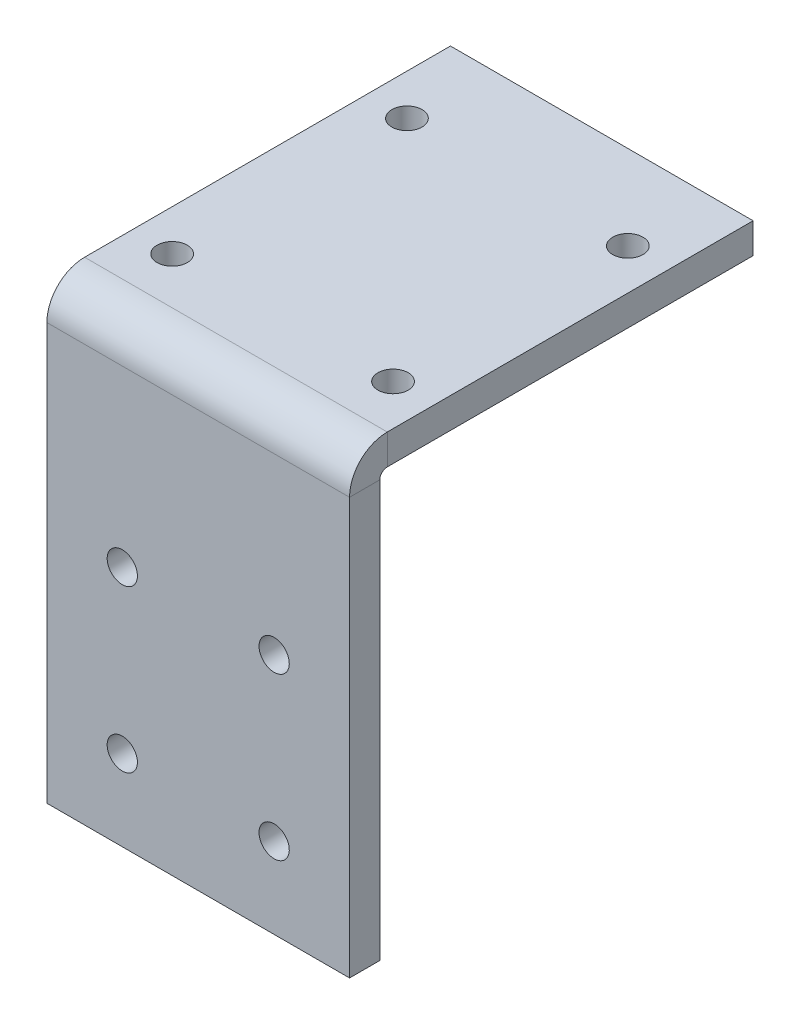
ISO-10303-21;
HEADER;
FILE_DESCRIPTION(('STEP AP214'),'2;1');
FILE_NAME('part.step','',(''),(''),'','','');
FILE_SCHEMA(('AUTOMOTIVE_DESIGN { 1 0 10303 214 1 1 1 1 }'));
ENDSEC;
DATA;
#1=APPLICATION_CONTEXT('core data for automotive mechanical design processes');
#2=APPLICATION_PROTOCOL_DEFINITION('international standard','automotive_design',2000,#1);
#3=PRODUCT_CONTEXT('',#1,'mechanical');
#4=PRODUCT('Part','Part','',(#3));
#5=PRODUCT_RELATED_PRODUCT_CATEGORY('part','',(#4));
#6=PRODUCT_DEFINITION_FORMATION('','',#4);
#7=PRODUCT_DEFINITION_CONTEXT('part definition',#1,'design');
#8=PRODUCT_DEFINITION('design','',#6,#7);
#9=PRODUCT_DEFINITION_SHAPE('','',#8);
#10=(LENGTH_UNIT() NAMED_UNIT(*) SI_UNIT(.MILLI.,.METRE.));
#11=(NAMED_UNIT(*) PLANE_ANGLE_UNIT() SI_UNIT($,.RADIAN.));
#12=(NAMED_UNIT(*) SI_UNIT($,.STERADIAN.) SOLID_ANGLE_UNIT());
#13=UNCERTAINTY_MEASURE_WITH_UNIT(LENGTH_MEASURE(1.E-05),#10,'distance_accuracy_value','');
#14=(GEOMETRIC_REPRESENTATION_CONTEXT(3) GLOBAL_UNCERTAINTY_ASSIGNED_CONTEXT((#13)) GLOBAL_UNIT_ASSIGNED_CONTEXT((#10,
#11,#12)) REPRESENTATION_CONTEXT('',''));
#15=CARTESIAN_POINT('',(0.,0.,0.));
#16=DIRECTION('',(0.,0.,1.));
#17=DIRECTION('',(1.,0.,0.));
#18=AXIS2_PLACEMENT_3D('',#15,#16,#17);
#19=CARTESIAN_POINT('',(-15.,-3.,-20.));
#20=DIRECTION('',(-1.,0.,0.));
#21=DIRECTION('',(0.,0.,1.));
#22=AXIS2_PLACEMENT_3D('',#19,#20,#21);
#23=PLANE('',#22);
#24=DIRECTION('',(0.,0.,1.));
#25=VECTOR('',#24,1.);
#26=CARTESIAN_POINT('',(-15.,-3.,-20.));
#27=LINE('',#26,#25);
#28=CARTESIAN_POINT('',(-15.,-3.,-20.));
#29=VERTEX_POINT('',#28);
#30=CARTESIAN_POINT('',(-15.,-3.,16.2634));
#31=VERTEX_POINT('',#30);
#32=EDGE_CURVE('E121',#29,#31,#27,.T.);
#33=ORIENTED_EDGE('',*,*,#32,.T.);
#34=DIRECTION('',(0.,1.,0.));
#35=VECTOR('',#34,1.);
#36=CARTESIAN_POINT('',(-15.,-3.,16.2634));
#37=LINE('',#36,#35);
#38=CARTESIAN_POINT('',(-15.,0.,16.2634));
#39=VERTEX_POINT('',#38);
#40=EDGE_CURVE('E106',#31,#39,#37,.T.);
#41=ORIENTED_EDGE('',*,*,#40,.T.);
#42=DIRECTION('',(0.,0.,1.));
#43=VECTOR('',#42,1.);
#44=CARTESIAN_POINT('',(-15.,0.,-20.));
#45=LINE('',#44,#43);
#46=CARTESIAN_POINT('',(-15.,0.,-20.));
#47=VERTEX_POINT('',#46);
#48=EDGE_CURVE('E104',#47,#39,#45,.T.);
#49=ORIENTED_EDGE('',*,*,#48,.F.);
#50=DIRECTION('',(0.,1.,0.));
#51=VECTOR('',#50,1.);
#52=CARTESIAN_POINT('',(-15.,-3.,-20.));
#53=LINE('',#52,#51);
#54=EDGE_CURVE('E13',#29,#47,#53,.T.);
#55=ORIENTED_EDGE('',*,*,#54,.F.);
#56=EDGE_LOOP('',(#33,#41,#49,#55));
#57=FACE_BOUND('',#56,.T.);
#58=ADVANCED_FACE('F59',(#57),#23,.T.);
#59=CARTESIAN_POINT('',(0.,-3.,0.));
#60=DIRECTION('',(0.,1.,0.));
#61=DIRECTION('',(0.,0.,1.));
#62=AXIS2_PLACEMENT_3D('',#59,#60,#61);
#63=PLANE('',#62);
#64=CARTESIAN_POINT('',(-10.9474706645221,-3.,-11.6351258570171));
#65=DIRECTION('',(0.,-1.,0.));
#66=DIRECTION('',(0.,0.,1.));
#67=AXIS2_PLACEMENT_3D('',#64,#65,#66);
#68=CIRCLE('',#67,1.5);
#69=CARTESIAN_POINT('',(-10.9474706645221,-3.,-10.1351258570171));
#70=VERTEX_POINT('',#69);
#71=EDGE_CURVE('E323',#70,#70,#68,.T.);
#72=ORIENTED_EDGE('',*,*,#71,.F.);
#73=EDGE_LOOP('',(#72));
#74=FACE_BOUND('',#73,.T.);
#75=CARTESIAN_POINT('',(10.9474706645221,-3.,-11.6351258570171));
#76=DIRECTION('',(0.,-1.,0.));
#77=DIRECTION('',(0.,0.,-1.));
#78=AXIS2_PLACEMENT_3D('',#75,#76,#77);
#79=CIRCLE('',#78,1.5);
#80=CARTESIAN_POINT('',(10.9474706645221,-3.,-13.1351258570171));
#81=VERTEX_POINT('',#80);
#82=EDGE_CURVE('E318',#81,#81,#79,.T.);
#83=ORIENTED_EDGE('',*,*,#82,.F.);
#84=EDGE_LOOP('',(#83));
#85=FACE_BOUND('',#84,.T.);
#86=CARTESIAN_POINT('',(10.9474706645221,-3.,11.6351258570171));
#87=DIRECTION('',(0.,-1.,0.));
#88=DIRECTION('',(0.,0.,1.));
#89=AXIS2_PLACEMENT_3D('',#86,#87,#88);
#90=CIRCLE('',#89,1.5);
#91=CARTESIAN_POINT('',(10.9474706645221,-3.,13.1351258570171));
#92=VERTEX_POINT('',#91);
#93=EDGE_CURVE('E316',#92,#92,#90,.T.);
#94=ORIENTED_EDGE('',*,*,#93,.F.);
#95=EDGE_LOOP('',(#94));
#96=FACE_BOUND('',#95,.T.);
#97=CARTESIAN_POINT('',(-10.9474706645221,-3.,11.6351258570171));
#98=DIRECTION('',(0.,-1.,0.));
#99=DIRECTION('',(0.,0.,-1.));
#100=AXIS2_PLACEMENT_3D('',#97,#98,#99);
#101=CIRCLE('',#100,1.5);
#102=CARTESIAN_POINT('',(-10.9474706645221,-3.,10.1351258570171));
#103=VERTEX_POINT('',#102);
#104=EDGE_CURVE('E140',#103,#103,#101,.T.);
#105=ORIENTED_EDGE('',*,*,#104,.F.);
#106=EDGE_LOOP('',(#105));
#107=FACE_BOUND('',#106,.T.);
#108=DIRECTION('',(-1.,0.,0.));
#109=VECTOR('',#108,1.);
#110=CARTESIAN_POINT('',(-15.,-3.,16.2634));
#111=LINE('',#110,#109);
#112=CARTESIAN_POINT('',(15.,-3.,16.2634));
#113=VERTEX_POINT('',#112);
#114=EDGE_CURVE('E206',#31,#113,#111,.F.);
#115=ORIENTED_EDGE('',*,*,#114,.F.);
#116=ORIENTED_EDGE('',*,*,#32,.F.);
#117=DIRECTION('',(-1.,0.,0.));
#118=VECTOR('',#117,1.);
#119=CARTESIAN_POINT('',(-15.,-3.,-20.));
#120=LINE('',#119,#118);
#121=CARTESIAN_POINT('',(15.,-3.,-20.));
#122=VERTEX_POINT('',#121);
#123=EDGE_CURVE('E101',#122,#29,#120,.T.);
#124=ORIENTED_EDGE('',*,*,#123,.F.);
#125=DIRECTION('',(0.,0.,-1.));
#126=VECTOR('',#125,1.);
#127=CARTESIAN_POINT('',(15.,-3.,-20.));
#128=LINE('',#127,#126);
#129=EDGE_CURVE('E109',#113,#122,#128,.T.);
#130=ORIENTED_EDGE('',*,*,#129,.F.);
#131=EDGE_LOOP('',(#115,#116,#124,#130));
#132=FACE_BOUND('',#131,.T.);
#133=ADVANCED_FACE('F220',(#74,#85,#96,#107,#132),#63,.F.);
#134=CARTESIAN_POINT('',(0.,0.,0.));
#135=DIRECTION('',(0.,1.,0.));
#136=DIRECTION('',(0.,0.,1.));
#137=AXIS2_PLACEMENT_3D('',#134,#135,#136);
#138=PLANE('',#137);
#139=CARTESIAN_POINT('',(-10.9474706645221,0.,-11.6351258570171));
#140=DIRECTION('',(0.,1.,0.));
#141=DIRECTION('',(0.,0.,1.));
#142=AXIS2_PLACEMENT_3D('',#139,#140,#141);
#143=CIRCLE('',#142,1.5);
#144=CARTESIAN_POINT('',(-10.9474706645221,0.,-10.1351258570171));
#145=VERTEX_POINT('',#144);
#146=EDGE_CURVE('E63',#145,#145,#143,.T.);
#147=ORIENTED_EDGE('',*,*,#146,.F.);
#148=EDGE_LOOP('',(#147));
#149=FACE_BOUND('',#148,.T.);
#150=CARTESIAN_POINT('',(10.9474706645221,0.,-11.6351258570171));
#151=DIRECTION('',(0.,1.,0.));
#152=DIRECTION('',(0.,0.,1.));
#153=AXIS2_PLACEMENT_3D('',#150,#151,#152);
#154=CIRCLE('',#153,1.5);
#155=CARTESIAN_POINT('',(10.9474706645221,0.,-10.1351258570171));
#156=VERTEX_POINT('',#155);
#157=EDGE_CURVE('E142',#156,#156,#154,.T.);
#158=ORIENTED_EDGE('',*,*,#157,.F.);
#159=EDGE_LOOP('',(#158));
#160=FACE_BOUND('',#159,.T.);
#161=CARTESIAN_POINT('',(10.9474706645221,0.,11.6351258570171));
#162=DIRECTION('',(0.,1.,0.));
#163=DIRECTION('',(0.,0.,1.));
#164=AXIS2_PLACEMENT_3D('',#161,#162,#163);
#165=CIRCLE('',#164,1.5);
#166=CARTESIAN_POINT('',(10.9474706645221,0.,13.1351258570171));
#167=VERTEX_POINT('',#166);
#168=EDGE_CURVE('E139',#167,#167,#165,.T.);
#169=ORIENTED_EDGE('',*,*,#168,.F.);
#170=EDGE_LOOP('',(#169));
#171=FACE_BOUND('',#170,.T.);
#172=CARTESIAN_POINT('',(-10.9474706645221,0.,11.6351258570171));
#173=DIRECTION('',(0.,1.,0.));
#174=DIRECTION('',(0.,0.,1.));
#175=AXIS2_PLACEMENT_3D('',#172,#173,#174);
#176=CIRCLE('',#175,1.5);
#177=CARTESIAN_POINT('',(-10.9474706645221,0.,13.1351258570171));
#178=VERTEX_POINT('',#177);
#179=EDGE_CURVE('E136',#178,#178,#176,.T.);
#180=ORIENTED_EDGE('',*,*,#179,.F.);
#181=EDGE_LOOP('',(#180));
#182=FACE_BOUND('',#181,.T.);
#183=ORIENTED_EDGE('',*,*,#48,.T.);
#184=DIRECTION('',(-1.,0.,0.));
#185=VECTOR('',#184,1.);
#186=CARTESIAN_POINT('',(-15.,0.,16.2634));
#187=LINE('',#186,#185);
#188=CARTESIAN_POINT('',(15.,0.,16.2634));
#189=VERTEX_POINT('',#188);
#190=EDGE_CURVE('E197',#39,#189,#187,.F.);
#191=ORIENTED_EDGE('',*,*,#190,.T.);
#192=DIRECTION('',(0.,0.,-1.));
#193=VECTOR('',#192,1.);
#194=CARTESIAN_POINT('',(15.,0.,-20.));
#195=LINE('',#194,#193);
#196=CARTESIAN_POINT('',(15.,0.,-20.));
#197=VERTEX_POINT('',#196);
#198=EDGE_CURVE('E113',#189,#197,#195,.T.);
#199=ORIENTED_EDGE('',*,*,#198,.T.);
#200=DIRECTION('',(-1.,0.,0.));
#201=VECTOR('',#200,1.);
#202=CARTESIAN_POINT('',(-15.,0.,-20.));
#203=LINE('',#202,#201);
#204=EDGE_CURVE('E99',#197,#47,#203,.T.);
#205=ORIENTED_EDGE('',*,*,#204,.T.);
#206=EDGE_LOOP('',(#183,#191,#199,#205));
#207=FACE_BOUND('',#206,.T.);
#208=ADVANCED_FACE('F111',(#149,#160,#171,#182,#207),#138,.T.);
#209=CARTESIAN_POINT('',(15.,-3.,-20.));
#210=DIRECTION('',(1.,0.,0.));
#211=DIRECTION('',(0.,0.,-1.));
#212=AXIS2_PLACEMENT_3D('',#209,#210,#211);
#213=PLANE('',#212);
#214=DIRECTION('',(0.,1.,0.));
#215=VECTOR('',#214,1.);
#216=CARTESIAN_POINT('',(15.,-3.,16.2634));
#217=LINE('',#216,#215);
#218=EDGE_CURVE('E116',#113,#189,#217,.T.);
#219=ORIENTED_EDGE('',*,*,#218,.F.);
#220=ORIENTED_EDGE('',*,*,#129,.T.);
#221=DIRECTION('',(0.,1.,0.));
#222=VECTOR('',#221,1.);
#223=CARTESIAN_POINT('',(15.,-3.,-20.));
#224=LINE('',#223,#222);
#225=EDGE_CURVE('E68',#122,#197,#224,.T.);
#226=ORIENTED_EDGE('',*,*,#225,.T.);
#227=ORIENTED_EDGE('',*,*,#198,.F.);
#228=EDGE_LOOP('',(#219,#220,#226,#227));
#229=FACE_BOUND('',#228,.T.);
#230=ADVANCED_FACE('F61',(#229),#213,.T.);
#231=CARTESIAN_POINT('',(-15.,-3.,-20.));
#232=DIRECTION('',(0.,0.,-1.));
#233=DIRECTION('',(-1.,0.,0.));
#234=AXIS2_PLACEMENT_3D('',#231,#232,#233);
#235=PLANE('',#234);
#236=ORIENTED_EDGE('',*,*,#204,.F.);
#237=ORIENTED_EDGE('',*,*,#225,.F.);
#238=ORIENTED_EDGE('',*,*,#123,.T.);
#239=ORIENTED_EDGE('',*,*,#54,.T.);
#240=EDGE_LOOP('',(#236,#237,#238,#239));
#241=FACE_BOUND('',#240,.T.);
#242=ADVANCED_FACE('F96',(#241),#235,.T.);
#243=CARTESIAN_POINT('',(15.,-3.7366,16.2634));
#244=DIRECTION('',(1.,0.,0.));
#245=DIRECTION('',(0.,0.,-1.));
#246=AXIS2_PLACEMENT_3D('',#243,#244,#245);
#247=PLANE('',#246);
#248=DIRECTION('',(0.,0.,-1.));
#249=VECTOR('',#248,1.);
#250=CARTESIAN_POINT('',(15.,-3.7366,20.));
#251=LINE('',#250,#249);
#252=CARTESIAN_POINT('',(15.,-3.73659999999999,17.));
#253=VERTEX_POINT('',#252);
#254=CARTESIAN_POINT('',(15.,-3.73659999999998,20.));
#255=VERTEX_POINT('',#254);
#256=EDGE_CURVE('E135',#253,#255,#251,.F.);
#257=ORIENTED_EDGE('',*,*,#256,.F.);
#258=CARTESIAN_POINT('',(15.,-3.7366,16.2634));
#259=DIRECTION('',(-1.,0.,0.));
#260=DIRECTION('',(0.,0.,1.));
#261=AXIS2_PLACEMENT_3D('',#258,#259,#260);
#262=CIRCLE('',#261,0.7366);
#263=EDGE_CURVE('E203',#113,#253,#262,.F.);
#264=ORIENTED_EDGE('',*,*,#263,.F.);
#265=ORIENTED_EDGE('',*,*,#218,.T.);
#266=CARTESIAN_POINT('',(15.,-3.7366,16.2634));
#267=DIRECTION('',(-1.,0.,0.));
#268=DIRECTION('',(0.,0.,1.));
#269=AXIS2_PLACEMENT_3D('',#266,#267,#268);
#270=CIRCLE('',#269,3.7366);
#271=EDGE_CURVE('E76',#189,#255,#270,.F.);
#272=ORIENTED_EDGE('',*,*,#271,.T.);
#273=EDGE_LOOP('',(#257,#264,#265,#272));
#274=FACE_BOUND('',#273,.T.);
#275=ADVANCED_FACE('F233',(#274),#247,.T.);
#276=CARTESIAN_POINT('',(-15.,-3.7366,16.2634));
#277=DIRECTION('',(1.,0.,0.));
#278=DIRECTION('',(0.,0.,-1.));
#279=AXIS2_PLACEMENT_3D('',#276,#277,#278);
#280=PLANE('',#279);
#281=CARTESIAN_POINT('',(-15.,-3.7366,16.2634));
#282=DIRECTION('',(-1.,0.,0.));
#283=DIRECTION('',(0.,0.,1.));
#284=AXIS2_PLACEMENT_3D('',#281,#282,#283);
#285=CIRCLE('',#284,0.7366);
#286=CARTESIAN_POINT('',(-15.,-3.73659999999999,17.));
#287=VERTEX_POINT('',#286);
#288=EDGE_CURVE('E165',#287,#31,#285,.T.);
#289=ORIENTED_EDGE('',*,*,#288,.F.);
#290=DIRECTION('',(0.,0.,-1.));
#291=VECTOR('',#290,1.);
#292=CARTESIAN_POINT('',(-15.,-3.7366,17.));
#293=LINE('',#292,#291);
#294=CARTESIAN_POINT('',(-15.,-3.7366,20.));
#295=VERTEX_POINT('',#294);
#296=EDGE_CURVE('E189',#287,#295,#293,.F.);
#297=ORIENTED_EDGE('',*,*,#296,.T.);
#298=CARTESIAN_POINT('',(-15.,-3.7366,16.2634));
#299=DIRECTION('',(-1.,0.,0.));
#300=DIRECTION('',(0.,0.,1.));
#301=AXIS2_PLACEMENT_3D('',#298,#299,#300);
#302=CIRCLE('',#301,3.7366);
#303=EDGE_CURVE('E199',#295,#39,#302,.T.);
#304=ORIENTED_EDGE('',*,*,#303,.T.);
#305=ORIENTED_EDGE('',*,*,#40,.F.);
#306=EDGE_LOOP('',(#289,#297,#304,#305));
#307=FACE_BOUND('',#306,.T.);
#308=ADVANCED_FACE('F250',(#307),#280,.F.);
#309=CARTESIAN_POINT('',(-15.,-3.7366,16.2634));
#310=DIRECTION('',(-1.,0.,0.));
#311=DIRECTION('',(0.,0.,1.));
#312=AXIS2_PLACEMENT_3D('',#309,#310,#311);
#313=CYLINDRICAL_SURFACE('',#312,3.7366);
#314=ORIENTED_EDGE('',*,*,#190,.F.);
#315=ORIENTED_EDGE('',*,*,#303,.F.);
#316=DIRECTION('',(-1.,0.,0.));
#317=VECTOR('',#316,1.);
#318=CARTESIAN_POINT('',(15.,-3.7366,20.));
#319=LINE('',#318,#317);
#320=EDGE_CURVE('E187',#295,#255,#319,.F.);
#321=ORIENTED_EDGE('',*,*,#320,.T.);
#322=ORIENTED_EDGE('',*,*,#271,.F.);
#323=EDGE_LOOP('',(#314,#315,#321,#322));
#324=FACE_BOUND('',#323,.T.);
#325=ADVANCED_FACE('F253',(#324),#313,.T.);
#326=CARTESIAN_POINT('',(-15.,-3.7366,16.2634));
#327=DIRECTION('',(-1.,0.,0.));
#328=DIRECTION('',(0.,0.,1.));
#329=AXIS2_PLACEMENT_3D('',#326,#327,#328);
#330=CYLINDRICAL_SURFACE('',#329,0.7366);
#331=ORIENTED_EDGE('',*,*,#114,.T.);
#332=ORIENTED_EDGE('',*,*,#263,.T.);
#333=DIRECTION('',(-1.,0.,0.));
#334=VECTOR('',#333,1.);
#335=CARTESIAN_POINT('',(15.,-3.7366,17.));
#336=LINE('',#335,#334);
#337=EDGE_CURVE('E192',#253,#287,#336,.T.);
#338=ORIENTED_EDGE('',*,*,#337,.T.);
#339=ORIENTED_EDGE('',*,*,#288,.T.);
#340=EDGE_LOOP('',(#331,#332,#338,#339));
#341=FACE_BOUND('',#340,.T.);
#342=ADVANCED_FACE('F224',(#341),#330,.F.);
#343=CARTESIAN_POINT('',(-15.,-45.,20.0000000000001));
#344=DIRECTION('',(1.,0.,0.));
#345=DIRECTION('',(0.,0.,-1.));
#346=AXIS2_PLACEMENT_3D('',#343,#344,#345);
#347=PLANE('',#346);
#348=ORIENTED_EDGE('',*,*,#296,.F.);
#349=DIRECTION('',(0.,1.,0.));
#350=VECTOR('',#349,1.);
#351=CARTESIAN_POINT('',(-15.,-45.,17.0000000000001));
#352=LINE('',#351,#350);
#353=CARTESIAN_POINT('',(-15.,-45.,17.0000000000001));
#354=VERTEX_POINT('',#353);
#355=EDGE_CURVE('E184',#287,#354,#352,.F.);
#356=ORIENTED_EDGE('',*,*,#355,.T.);
#357=DIRECTION('',(0.,0.,-1.));
#358=VECTOR('',#357,1.);
#359=CARTESIAN_POINT('',(-15.,-45.,20.0000000000001));
#360=LINE('',#359,#358);
#361=CARTESIAN_POINT('',(-15.,-45.,20.0000000000001));
#362=VERTEX_POINT('',#361);
#363=EDGE_CURVE('E162',#362,#354,#360,.T.);
#364=ORIENTED_EDGE('',*,*,#363,.F.);
#365=DIRECTION('',(0.,-1.,0.));
#366=VECTOR('',#365,1.);
#367=CARTESIAN_POINT('',(-15.,0.,20.));
#368=LINE('',#367,#366);
#369=EDGE_CURVE('E175',#295,#362,#368,.T.);
#370=ORIENTED_EDGE('',*,*,#369,.F.);
#371=EDGE_LOOP('',(#348,#356,#364,#370));
#372=FACE_BOUND('',#371,.T.);
#373=ADVANCED_FACE('F259',(#372),#347,.F.);
#374=CARTESIAN_POINT('',(15.,-2.99999999999999,20.));
#375=DIRECTION('',(-1.,0.,0.));
#376=DIRECTION('',(0.,0.,1.));
#377=AXIS2_PLACEMENT_3D('',#374,#375,#376);
#378=PLANE('',#377);
#379=ORIENTED_EDGE('',*,*,#256,.T.);
#380=DIRECTION('',(0.,1.,0.));
#381=VECTOR('',#380,1.);
#382=CARTESIAN_POINT('',(15.,0.,20.));
#383=LINE('',#382,#381);
#384=CARTESIAN_POINT('',(15.,-45.,20.0000000000001));
#385=VERTEX_POINT('',#384);
#386=EDGE_CURVE('E169',#385,#255,#383,.T.);
#387=ORIENTED_EDGE('',*,*,#386,.F.);
#388=DIRECTION('',(0.,0.,-1.));
#389=VECTOR('',#388,1.);
#390=CARTESIAN_POINT('',(15.,-45.,20.0000000000001));
#391=LINE('',#390,#389);
#392=CARTESIAN_POINT('',(15.,-45.,17.0000000000001));
#393=VERTEX_POINT('',#392);
#394=EDGE_CURVE('E166',#385,#393,#391,.T.);
#395=ORIENTED_EDGE('',*,*,#394,.T.);
#396=DIRECTION('',(0.,-1.,0.));
#397=VECTOR('',#396,1.);
#398=CARTESIAN_POINT('',(15.,-3.,17.));
#399=LINE('',#398,#397);
#400=EDGE_CURVE('E178',#393,#253,#399,.F.);
#401=ORIENTED_EDGE('',*,*,#400,.T.);
#402=EDGE_LOOP('',(#379,#387,#395,#401));
#403=FACE_BOUND('',#402,.T.);
#404=ADVANCED_FACE('F264',(#403),#378,.F.);
#405=CARTESIAN_POINT('',(0.,0.,20.));
#406=DIRECTION('',(0.,0.,-1.));
#407=DIRECTION('',(0.,1.,0.));
#408=AXIS2_PLACEMENT_3D('',#405,#406,#407);
#409=PLANE('',#408);
#410=CARTESIAN_POINT('',(7.52569842666641,-21.,20.));
#411=DIRECTION('',(0.,0.,1.));
#412=DIRECTION('',(-1.,0.,0.));
#413=AXIS2_PLACEMENT_3D('',#410,#411,#412);
#414=CIRCLE('',#413,1.5);
#415=CARTESIAN_POINT('',(6.02569842666641,-21.,20.));
#416=VERTEX_POINT('',#415);
#417=EDGE_CURVE('E147',#416,#416,#414,.T.);
#418=ORIENTED_EDGE('',*,*,#417,.F.);
#419=EDGE_LOOP('',(#418));
#420=FACE_BOUND('',#419,.T.);
#421=CARTESIAN_POINT('',(7.52569842666642,-37.,20.));
#422=DIRECTION('',(0.,0.,1.));
#423=DIRECTION('',(-1.,0.,0.));
#424=AXIS2_PLACEMENT_3D('',#421,#422,#423);
#425=CIRCLE('',#424,1.5);
#426=CARTESIAN_POINT('',(6.02569842666642,-37.,20.));
#427=VERTEX_POINT('',#426);
#428=EDGE_CURVE('E151',#427,#427,#425,.T.);
#429=ORIENTED_EDGE('',*,*,#428,.F.);
#430=EDGE_LOOP('',(#429));
#431=FACE_BOUND('',#430,.T.);
#432=CARTESIAN_POINT('',(-7.52569842666641,-37.,20.));
#433=DIRECTION('',(0.,0.,1.));
#434=DIRECTION('',(1.,0.,0.));
#435=AXIS2_PLACEMENT_3D('',#432,#433,#434);
#436=CIRCLE('',#435,1.5);
#437=CARTESIAN_POINT('',(-6.02569842666641,-37.,20.));
#438=VERTEX_POINT('',#437);
#439=EDGE_CURVE('E156',#438,#438,#436,.T.);
#440=ORIENTED_EDGE('',*,*,#439,.F.);
#441=EDGE_LOOP('',(#440));
#442=FACE_BOUND('',#441,.T.);
#443=CARTESIAN_POINT('',(-7.52569842666641,-21.,20.));
#444=DIRECTION('',(0.,0.,1.));
#445=DIRECTION('',(1.,0.,0.));
#446=AXIS2_PLACEMENT_3D('',#443,#444,#445);
#447=CIRCLE('',#446,1.5);
#448=CARTESIAN_POINT('',(-6.02569842666641,-21.,20.));
#449=VERTEX_POINT('',#448);
#450=EDGE_CURVE('E126',#449,#449,#447,.T.);
#451=ORIENTED_EDGE('',*,*,#450,.F.);
#452=EDGE_LOOP('',(#451));
#453=FACE_BOUND('',#452,.T.);
#454=ORIENTED_EDGE('',*,*,#320,.F.);
#455=ORIENTED_EDGE('',*,*,#369,.T.);
#456=DIRECTION('',(1.,0.,0.));
#457=VECTOR('',#456,1.);
#458=CARTESIAN_POINT('',(0.,-45.,20.0000000000001));
#459=LINE('',#458,#457);
#460=EDGE_CURVE('E172',#362,#385,#459,.T.);
#461=ORIENTED_EDGE('',*,*,#460,.T.);
#462=ORIENTED_EDGE('',*,*,#386,.T.);
#463=EDGE_LOOP('',(#454,#455,#461,#462));
#464=FACE_BOUND('',#463,.T.);
#465=ADVANCED_FACE('F274',(#420,#431,#442,#453,#464),#409,.F.);
#466=CARTESIAN_POINT('',(0.,0.,17.));
#467=DIRECTION('',(0.,0.,-1.));
#468=DIRECTION('',(0.,1.,0.));
#469=AXIS2_PLACEMENT_3D('',#466,#467,#468);
#470=PLANE('',#469);
#471=CARTESIAN_POINT('',(7.52569842666641,-21.,17.0000000000001));
#472=DIRECTION('',(0.,0.,-1.));
#473=DIRECTION('',(0.,1.,0.));
#474=AXIS2_PLACEMENT_3D('',#471,#472,#473);
#475=CIRCLE('',#474,1.5);
#476=CARTESIAN_POINT('',(7.52569842666641,-19.5,17.0000000000001));
#477=VERTEX_POINT('',#476);
#478=EDGE_CURVE('E132',#477,#477,#475,.T.);
#479=ORIENTED_EDGE('',*,*,#478,.F.);
#480=EDGE_LOOP('',(#479));
#481=FACE_BOUND('',#480,.T.);
#482=CARTESIAN_POINT('',(7.52569842666642,-37.,17.0000000000001));
#483=DIRECTION('',(0.,0.,-1.));
#484=DIRECTION('',(0.,1.,0.));
#485=AXIS2_PLACEMENT_3D('',#482,#483,#484);
#486=CIRCLE('',#485,1.5);
#487=CARTESIAN_POINT('',(7.52569842666642,-35.5,17.0000000000001));
#488=VERTEX_POINT('',#487);
#489=EDGE_CURVE('E129',#488,#488,#486,.T.);
#490=ORIENTED_EDGE('',*,*,#489,.F.);
#491=EDGE_LOOP('',(#490));
#492=FACE_BOUND('',#491,.T.);
#493=CARTESIAN_POINT('',(-7.52569842666641,-37.,17.0000000000001));
#494=DIRECTION('',(0.,0.,-1.));
#495=DIRECTION('',(0.,1.,0.));
#496=AXIS2_PLACEMENT_3D('',#493,#494,#495);
#497=CIRCLE('',#496,1.5);
#498=CARTESIAN_POINT('',(-7.52569842666641,-35.5,17.0000000000001));
#499=VERTEX_POINT('',#498);
#500=EDGE_CURVE('E125',#499,#499,#497,.T.);
#501=ORIENTED_EDGE('',*,*,#500,.F.);
#502=EDGE_LOOP('',(#501));
#503=FACE_BOUND('',#502,.T.);
#504=CARTESIAN_POINT('',(-7.52569842666641,-21.,17.0000000000001));
#505=DIRECTION('',(0.,0.,-1.));
#506=DIRECTION('',(0.,1.,0.));
#507=AXIS2_PLACEMENT_3D('',#504,#505,#506);
#508=CIRCLE('',#507,1.5);
#509=CARTESIAN_POINT('',(-7.52569842666641,-19.5,17.0000000000001));
#510=VERTEX_POINT('',#509);
#511=EDGE_CURVE('E122',#510,#510,#508,.T.);
#512=ORIENTED_EDGE('',*,*,#511,.F.);
#513=EDGE_LOOP('',(#512));
#514=FACE_BOUND('',#513,.T.);
#515=ORIENTED_EDGE('',*,*,#355,.F.);
#516=ORIENTED_EDGE('',*,*,#337,.F.);
#517=ORIENTED_EDGE('',*,*,#400,.F.);
#518=DIRECTION('',(-1.,0.,0.));
#519=VECTOR('',#518,1.);
#520=CARTESIAN_POINT('',(15.,-45.,17.0000000000001));
#521=LINE('',#520,#519);
#522=EDGE_CURVE('E181',#354,#393,#521,.F.);
#523=ORIENTED_EDGE('',*,*,#522,.F.);
#524=EDGE_LOOP('',(#515,#516,#517,#523));
#525=FACE_BOUND('',#524,.T.);
#526=ADVANCED_FACE('F270',(#481,#492,#503,#514,#525),#470,.T.);
#527=CARTESIAN_POINT('',(15.,-45.,20.0000000000001));
#528=DIRECTION('',(0.,1.,0.));
#529=DIRECTION('',(0.,0.,1.));
#530=AXIS2_PLACEMENT_3D('',#527,#528,#529);
#531=PLANE('',#530);
#532=ORIENTED_EDGE('',*,*,#522,.T.);
#533=ORIENTED_EDGE('',*,*,#394,.F.);
#534=ORIENTED_EDGE('',*,*,#460,.F.);
#535=ORIENTED_EDGE('',*,*,#363,.T.);
#536=EDGE_LOOP('',(#532,#533,#534,#535));
#537=FACE_BOUND('',#536,.T.);
#538=ADVANCED_FACE('F266',(#537),#531,.F.);
#539=CARTESIAN_POINT('',(-7.52569842666641,-21.,9.99999999999999));
#540=DIRECTION('',(0.,0.,1.));
#541=DIRECTION('',(1.,0.,0.));
#542=AXIS2_PLACEMENT_3D('',#539,#540,#541);
#543=CYLINDRICAL_SURFACE('',#542,1.5);
#544=ORIENTED_EDGE('',*,*,#511,.T.);
#545=EDGE_LOOP('',(#544));
#546=FACE_BOUND('',#545,.T.);
#547=ORIENTED_EDGE('',*,*,#450,.T.);
#548=EDGE_LOOP('',(#547));
#549=FACE_BOUND('',#548,.T.);
#550=ADVANCED_FACE('F269',(#546,#549),#543,.F.);
#551=CARTESIAN_POINT('',(-7.52569842666641,-37.,9.99999999999999));
#552=DIRECTION('',(0.,0.,1.));
#553=DIRECTION('',(1.,0.,0.));
#554=AXIS2_PLACEMENT_3D('',#551,#552,#553);
#555=CYLINDRICAL_SURFACE('',#554,1.5);
#556=ORIENTED_EDGE('',*,*,#500,.T.);
#557=EDGE_LOOP('',(#556));
#558=FACE_BOUND('',#557,.T.);
#559=ORIENTED_EDGE('',*,*,#439,.T.);
#560=EDGE_LOOP('',(#559));
#561=FACE_BOUND('',#560,.T.);
#562=ADVANCED_FACE('F284',(#558,#561),#555,.F.);
#563=CARTESIAN_POINT('',(7.52569842666642,-37.,9.99999999999999));
#564=DIRECTION('',(0.,0.,1.));
#565=DIRECTION('',(1.,0.,0.));
#566=AXIS2_PLACEMENT_3D('',#563,#564,#565);
#567=CYLINDRICAL_SURFACE('',#566,1.5);
#568=ORIENTED_EDGE('',*,*,#489,.T.);
#569=EDGE_LOOP('',(#568));
#570=FACE_BOUND('',#569,.T.);
#571=ORIENTED_EDGE('',*,*,#428,.T.);
#572=EDGE_LOOP('',(#571));
#573=FACE_BOUND('',#572,.T.);
#574=ADVANCED_FACE('F290',(#570,#573),#567,.F.);
#575=CARTESIAN_POINT('',(7.52569842666641,-21.,9.99999999999999));
#576=DIRECTION('',(0.,0.,1.));
#577=DIRECTION('',(1.,0.,0.));
#578=AXIS2_PLACEMENT_3D('',#575,#576,#577);
#579=CYLINDRICAL_SURFACE('',#578,1.5);
#580=ORIENTED_EDGE('',*,*,#478,.T.);
#581=EDGE_LOOP('',(#580));
#582=FACE_BOUND('',#581,.T.);
#583=ORIENTED_EDGE('',*,*,#417,.T.);
#584=EDGE_LOOP('',(#583));
#585=FACE_BOUND('',#584,.T.);
#586=ADVANCED_FACE('F286',(#582,#585),#579,.F.);
#587=CARTESIAN_POINT('',(-10.9474706645221,7.,11.6351258570171));
#588=DIRECTION('',(0.,-1.,0.));
#589=DIRECTION('',(0.,0.,-1.));
#590=AXIS2_PLACEMENT_3D('',#587,#588,#589);
#591=CYLINDRICAL_SURFACE('',#590,1.5);
#592=ORIENTED_EDGE('',*,*,#179,.T.);
#593=EDGE_LOOP('',(#592));
#594=FACE_BOUND('',#593,.T.);
#595=ORIENTED_EDGE('',*,*,#104,.T.);
#596=EDGE_LOOP('',(#595));
#597=FACE_BOUND('',#596,.T.);
#598=ADVANCED_FACE('F289',(#594,#597),#591,.F.);
#599=CARTESIAN_POINT('',(10.9474706645221,7.,11.6351258570171));
#600=DIRECTION('',(0.,-1.,0.));
#601=DIRECTION('',(0.,0.,-1.));
#602=AXIS2_PLACEMENT_3D('',#599,#600,#601);
#603=CYLINDRICAL_SURFACE('',#602,1.5);
#604=ORIENTED_EDGE('',*,*,#168,.T.);
#605=EDGE_LOOP('',(#604));
#606=FACE_BOUND('',#605,.T.);
#607=ORIENTED_EDGE('',*,*,#93,.T.);
#608=EDGE_LOOP('',(#607));
#609=FACE_BOUND('',#608,.T.);
#610=ADVANCED_FACE('F300',(#606,#609),#603,.F.);
#611=CARTESIAN_POINT('',(10.9474706645221,7.,-11.6351258570171));
#612=DIRECTION('',(0.,-1.,0.));
#613=DIRECTION('',(0.,0.,-1.));
#614=AXIS2_PLACEMENT_3D('',#611,#612,#613);
#615=CYLINDRICAL_SURFACE('',#614,1.5);
#616=ORIENTED_EDGE('',*,*,#157,.T.);
#617=EDGE_LOOP('',(#616));
#618=FACE_BOUND('',#617,.T.);
#619=ORIENTED_EDGE('',*,*,#82,.T.);
#620=EDGE_LOOP('',(#619));
#621=FACE_BOUND('',#620,.T.);
#622=ADVANCED_FACE('F305',(#618,#621),#615,.F.);
#623=CARTESIAN_POINT('',(-10.9474706645221,7.,-11.6351258570171));
#624=DIRECTION('',(0.,-1.,0.));
#625=DIRECTION('',(0.,0.,-1.));
#626=AXIS2_PLACEMENT_3D('',#623,#624,#625);
#627=CYLINDRICAL_SURFACE('',#626,1.5);
#628=ORIENTED_EDGE('',*,*,#146,.T.);
#629=EDGE_LOOP('',(#628));
#630=FACE_BOUND('',#629,.T.);
#631=ORIENTED_EDGE('',*,*,#71,.T.);
#632=EDGE_LOOP('',(#631));
#633=FACE_BOUND('',#632,.T.);
#634=ADVANCED_FACE('F302',(#630,#633),#627,.F.);
#635=CLOSED_SHELL('',(#58,#133,#208,#230,#242,#275,#308,#325,#342,#373,#404,#465,#526,#538,#550,
#562,#574,#586,#598,#610,#622,#634));
#636=MANIFOLD_SOLID_BREP('B2',#635);
#637=ADVANCED_BREP_SHAPE_REPRESENTATION('',(#18,#636),#14);
#638=SHAPE_DEFINITION_REPRESENTATION(#9,#637);
ENDSEC;
END-ISO-10303-21;
